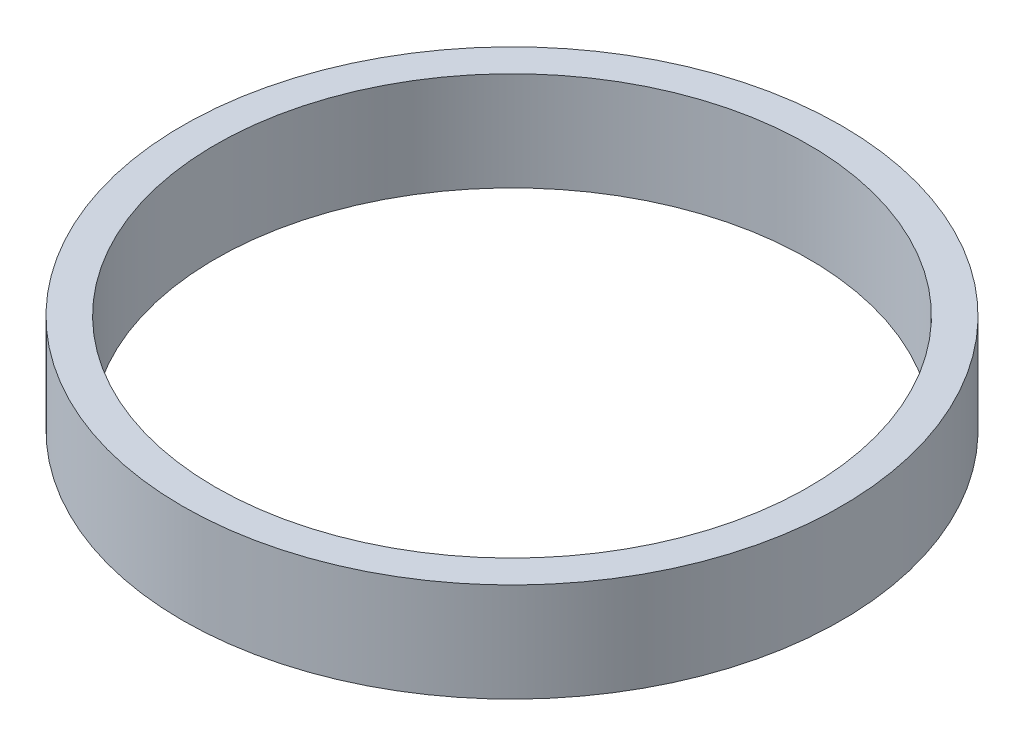
ISO-10303-21;
HEADER;
FILE_DESCRIPTION(('STEP AP214'),'2;1');
FILE_NAME('part.step','',(''),(''),'','','');
FILE_SCHEMA(('AUTOMOTIVE_DESIGN { 1 0 10303 214 1 1 1 1 }'));
ENDSEC;
DATA;
#1=APPLICATION_CONTEXT('core data for automotive mechanical design processes');
#2=APPLICATION_PROTOCOL_DEFINITION('international standard','automotive_design',2000,#1);
#3=PRODUCT_CONTEXT('',#1,'mechanical');
#4=PRODUCT('Part','Part','',(#3));
#5=PRODUCT_RELATED_PRODUCT_CATEGORY('part','',(#4));
#6=PRODUCT_DEFINITION_FORMATION('','',#4);
#7=PRODUCT_DEFINITION_CONTEXT('part definition',#1,'design');
#8=PRODUCT_DEFINITION('design','',#6,#7);
#9=PRODUCT_DEFINITION_SHAPE('','',#8);
#10=(LENGTH_UNIT() NAMED_UNIT(*) SI_UNIT(.MILLI.,.METRE.));
#11=(NAMED_UNIT(*) PLANE_ANGLE_UNIT() SI_UNIT($,.RADIAN.));
#12=(NAMED_UNIT(*) SI_UNIT($,.STERADIAN.) SOLID_ANGLE_UNIT());
#13=UNCERTAINTY_MEASURE_WITH_UNIT(LENGTH_MEASURE(1.E-05),#10,'distance_accuracy_value','');
#14=(GEOMETRIC_REPRESENTATION_CONTEXT(3) GLOBAL_UNCERTAINTY_ASSIGNED_CONTEXT((#13)) GLOBAL_UNIT_ASSIGNED_CONTEXT((#10,
#11,#12)) REPRESENTATION_CONTEXT('',''));
#15=CARTESIAN_POINT('',(0.,0.,0.));
#16=DIRECTION('',(0.,0.,1.));
#17=DIRECTION('',(1.,0.,0.));
#18=AXIS2_PLACEMENT_3D('',#15,#16,#17);
#19=CARTESIAN_POINT('',(0.,3.,0.));
#20=DIRECTION('',(0.,-1.,0.));
#21=DIRECTION('',(0.,0.,-1.));
#22=AXIS2_PLACEMENT_3D('',#19,#20,#21);
#23=CYLINDRICAL_SURFACE('',#22,10.);
#24=CARTESIAN_POINT('',(0.,3.,0.));
#25=DIRECTION('',(0.,1.,0.));
#26=DIRECTION('',(0.,0.,1.));
#27=AXIS2_PLACEMENT_3D('',#24,#25,#26);
#28=CIRCLE('',#27,10.);
#29=CARTESIAN_POINT('',(0.,3.,10.));
#30=VERTEX_POINT('',#29);
#31=EDGE_CURVE('E10',#30,#30,#28,.T.);
#32=ORIENTED_EDGE('',*,*,#31,.F.);
#33=EDGE_LOOP('',(#32));
#34=FACE_BOUND('',#33,.T.);
#35=CARTESIAN_POINT('',(0.,0.,0.));
#36=DIRECTION('',(0.,1.,0.));
#37=DIRECTION('',(0.,0.,1.));
#38=AXIS2_PLACEMENT_3D('',#35,#36,#37);
#39=CIRCLE('',#38,10.);
#40=CARTESIAN_POINT('',(0.,0.,10.));
#41=VERTEX_POINT('',#40);
#42=EDGE_CURVE('E34',#41,#41,#39,.T.);
#43=ORIENTED_EDGE('',*,*,#42,.T.);
#44=EDGE_LOOP('',(#43));
#45=FACE_BOUND('',#44,.T.);
#46=ADVANCED_FACE('F31',(#34,#45),#23,.T.);
#47=CARTESIAN_POINT('',(0.,3.,0.));
#48=DIRECTION('',(0.,1.,0.));
#49=DIRECTION('',(0.,0.,1.));
#50=AXIS2_PLACEMENT_3D('',#47,#48,#49);
#51=PLANE('',#50);
#52=CARTESIAN_POINT('',(0.,3.,0.));
#53=DIRECTION('',(0.,1.,0.));
#54=DIRECTION('',(0.,0.,1.));
#55=AXIS2_PLACEMENT_3D('',#52,#53,#54);
#56=CIRCLE('',#55,9.);
#57=CARTESIAN_POINT('',(0.,3.,9.));
#58=VERTEX_POINT('',#57);
#59=EDGE_CURVE('E43',#58,#58,#56,.T.);
#60=ORIENTED_EDGE('',*,*,#59,.F.);
#61=EDGE_LOOP('',(#60));
#62=FACE_BOUND('',#61,.T.);
#63=ORIENTED_EDGE('',*,*,#31,.T.);
#64=EDGE_LOOP('',(#63));
#65=FACE_BOUND('',#64,.T.);
#66=ADVANCED_FACE('F58',(#62,#65),#51,.T.);
#67=CARTESIAN_POINT('',(0.,0.,0.));
#68=DIRECTION('',(0.,1.,0.));
#69=DIRECTION('',(0.,0.,1.));
#70=AXIS2_PLACEMENT_3D('',#67,#68,#69);
#71=PLANE('',#70);
#72=CARTESIAN_POINT('',(0.,0.,0.));
#73=DIRECTION('',(0.,1.,0.));
#74=DIRECTION('',(0.,0.,1.));
#75=AXIS2_PLACEMENT_3D('',#72,#73,#74);
#76=CIRCLE('',#75,9.);
#77=CARTESIAN_POINT('',(0.,0.,9.));
#78=VERTEX_POINT('',#77);
#79=EDGE_CURVE('E41',#78,#78,#76,.T.);
#80=ORIENTED_EDGE('',*,*,#79,.T.);
#81=EDGE_LOOP('',(#80));
#82=FACE_BOUND('',#81,.T.);
#83=ORIENTED_EDGE('',*,*,#42,.F.);
#84=EDGE_LOOP('',(#83));
#85=FACE_BOUND('',#84,.T.);
#86=ADVANCED_FACE('F49',(#82,#85),#71,.F.);
#87=CARTESIAN_POINT('',(0.,0.,0.));
#88=DIRECTION('',(0.,1.,0.));
#89=DIRECTION('',(0.,0.,1.));
#90=AXIS2_PLACEMENT_3D('',#87,#88,#89);
#91=CYLINDRICAL_SURFACE('',#90,9.);
#92=ORIENTED_EDGE('',*,*,#79,.F.);
#93=EDGE_LOOP('',(#92));
#94=FACE_BOUND('',#93,.T.);
#95=ORIENTED_EDGE('',*,*,#59,.T.);
#96=EDGE_LOOP('',(#95));
#97=FACE_BOUND('',#96,.T.);
#98=ADVANCED_FACE('F52',(#94,#97),#91,.F.);
#99=CLOSED_SHELL('',(#46,#66,#86,#98));
#100=MANIFOLD_SOLID_BREP('B2',#99);
#101=ADVANCED_BREP_SHAPE_REPRESENTATION('',(#18,#100),#14);
#102=SHAPE_DEFINITION_REPRESENTATION(#9,#101);
ENDSEC;
END-ISO-10303-21;
